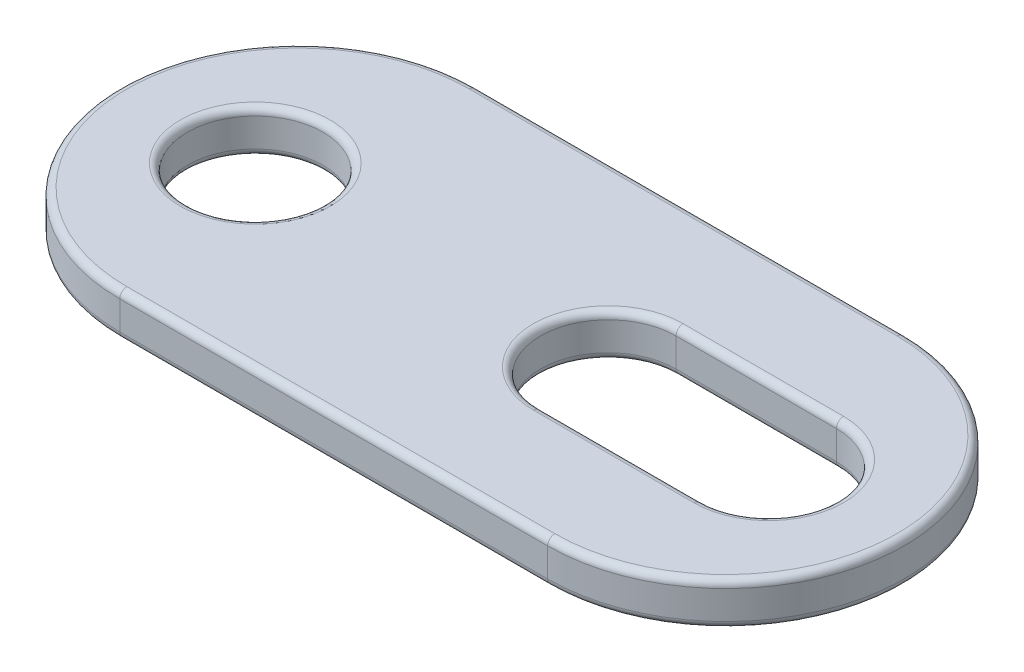
ISO-10303-21;
HEADER;
FILE_DESCRIPTION(('STEP AP214'),'2;1');
FILE_NAME('part.step','',(''),(''),'','','');
FILE_SCHEMA(('AUTOMOTIVE_DESIGN { 1 0 10303 214 1 1 1 1 }'));
ENDSEC;
DATA;
#1=APPLICATION_CONTEXT('core data for automotive mechanical design processes');
#2=APPLICATION_PROTOCOL_DEFINITION('international standard','automotive_design',2000,#1);
#3=PRODUCT_CONTEXT('',#1,'mechanical');
#4=PRODUCT('Part','Part','',(#3));
#5=PRODUCT_RELATED_PRODUCT_CATEGORY('part','',(#4));
#6=PRODUCT_DEFINITION_FORMATION('','',#4);
#7=PRODUCT_DEFINITION_CONTEXT('part definition',#1,'design');
#8=PRODUCT_DEFINITION('design','',#6,#7);
#9=PRODUCT_DEFINITION_SHAPE('','',#8);
#10=(LENGTH_UNIT() NAMED_UNIT(*) SI_UNIT(.MILLI.,.METRE.));
#11=(NAMED_UNIT(*) PLANE_ANGLE_UNIT() SI_UNIT($,.RADIAN.));
#12=(NAMED_UNIT(*) SI_UNIT($,.STERADIAN.) SOLID_ANGLE_UNIT());
#13=UNCERTAINTY_MEASURE_WITH_UNIT(LENGTH_MEASURE(1.E-05),#10,'distance_accuracy_value','');
#14=(GEOMETRIC_REPRESENTATION_CONTEXT(3) GLOBAL_UNCERTAINTY_ASSIGNED_CONTEXT((#13)) GLOBAL_UNIT_ASSIGNED_CONTEXT((#10,
#11,#12)) REPRESENTATION_CONTEXT('',''));
#15=CARTESIAN_POINT('',(0.,0.,0.));
#16=DIRECTION('',(0.,0.,1.));
#17=DIRECTION('',(1.,0.,0.));
#18=AXIS2_PLACEMENT_3D('',#15,#16,#17);
#19=CARTESIAN_POINT('',(0.,1.524,-6.35));
#20=DIRECTION('',(0.,1.,0.));
#21=DIRECTION('',(0.,0.,1.));
#22=AXIS2_PLACEMENT_3D('',#19,#20,#21);
#23=PLANE('',#22);
#24=DIRECTION('',(-1.,0.,0.));
#25=VECTOR('',#24,1.);
#26=CARTESIAN_POINT('',(0.,1.524,-9.017));
#27=LINE('',#26,#25);
#28=CARTESIAN_POINT('',(11.049,1.524,-9.017));
#29=VERTEX_POINT('',#28);
#30=CARTESIAN_POINT('',(16.764,1.524,-9.017));
#31=VERTEX_POINT('',#30);
#32=EDGE_CURVE('E52',#29,#31,#27,.F.);
#33=ORIENTED_EDGE('',*,*,#32,.T.);
#34=CARTESIAN_POINT('',(16.764,1.524,-6.35));
#35=DIRECTION('',(0.,1.,0.));
#36=DIRECTION('',(0.,0.,1.));
#37=AXIS2_PLACEMENT_3D('',#34,#35,#36);
#38=CIRCLE('',#37,2.667);
#39=CARTESIAN_POINT('',(16.764,1.524,-3.683));
#40=VERTEX_POINT('',#39);
#41=EDGE_CURVE('E12',#31,#40,#38,.F.);
#42=ORIENTED_EDGE('',*,*,#41,.T.);
#43=DIRECTION('',(1.,0.,0.));
#44=VECTOR('',#43,1.);
#45=CARTESIAN_POINT('',(0.,1.524,-3.683));
#46=LINE('',#45,#44);
#47=CARTESIAN_POINT('',(11.049,1.524,-3.683));
#48=VERTEX_POINT('',#47);
#49=EDGE_CURVE('E248',#40,#48,#46,.F.);
#50=ORIENTED_EDGE('',*,*,#49,.T.);
#51=CARTESIAN_POINT('',(11.049,1.524,-6.35));
#52=DIRECTION('',(0.,1.,0.));
#53=DIRECTION('',(0.,0.,1.));
#54=AXIS2_PLACEMENT_3D('',#51,#52,#53);
#55=CIRCLE('',#54,2.667);
#56=EDGE_CURVE('E62',#48,#29,#55,.F.);
#57=ORIENTED_EDGE('',*,*,#56,.T.);
#58=EDGE_LOOP('',(#33,#42,#50,#57));
#59=FACE_BOUND('',#58,.T.);
#60=CARTESIAN_POINT('',(15.24,1.524,-6.35));
#61=DIRECTION('',(0.,1.,0.));
#62=DIRECTION('',(0.,0.,1.));
#63=AXIS2_PLACEMENT_3D('',#60,#61,#62);
#64=CIRCLE('',#63,6.096);
#65=CARTESIAN_POINT('',(15.24,1.524,-0.254));
#66=VERTEX_POINT('',#65);
#67=CARTESIAN_POINT('',(15.24,1.524,-12.446));
#68=VERTEX_POINT('',#67);
#69=EDGE_CURVE('E243',#66,#68,#64,.T.);
#70=ORIENTED_EDGE('',*,*,#69,.T.);
#71=DIRECTION('',(-1.,0.,0.));
#72=VECTOR('',#71,1.);
#73=CARTESIAN_POINT('',(0.,1.524,-12.446));
#74=LINE('',#73,#72);
#75=CARTESIAN_POINT('',(0.,1.524,-12.446));
#76=VERTEX_POINT('',#75);
#77=EDGE_CURVE('E245',#68,#76,#74,.T.);
#78=ORIENTED_EDGE('',*,*,#77,.T.);
#79=CARTESIAN_POINT('',(0.,1.524,-6.35));
#80=DIRECTION('',(0.,1.,0.));
#81=DIRECTION('',(0.,0.,1.));
#82=AXIS2_PLACEMENT_3D('',#79,#80,#81);
#83=CIRCLE('',#82,6.096);
#84=CARTESIAN_POINT('',(0.,1.524,-0.254));
#85=VERTEX_POINT('',#84);
#86=EDGE_CURVE('E239',#76,#85,#83,.T.);
#87=ORIENTED_EDGE('',*,*,#86,.T.);
#88=DIRECTION('',(1.,0.,0.));
#89=VECTOR('',#88,1.);
#90=CARTESIAN_POINT('',(15.24,1.524,-0.254));
#91=LINE('',#90,#89);
#92=EDGE_CURVE('E241',#85,#66,#91,.T.);
#93=ORIENTED_EDGE('',*,*,#92,.T.);
#94=EDGE_LOOP('',(#70,#78,#87,#93));
#95=FACE_BOUND('',#94,.T.);
#96=CARTESIAN_POINT('',(-1.524,1.524,-6.35));
#97=DIRECTION('',(0.,1.,0.));
#98=DIRECTION('',(0.,0.,1.));
#99=AXIS2_PLACEMENT_3D('',#96,#97,#98);
#100=CIRCLE('',#99,2.667);
#101=CARTESIAN_POINT('',(-1.524,1.524,-3.683));
#102=VERTEX_POINT('',#101);
#103=EDGE_CURVE('E236',#102,#102,#100,.F.);
#104=ORIENTED_EDGE('',*,*,#103,.T.);
#105=EDGE_LOOP('',(#104));
#106=FACE_BOUND('',#105,.T.);
#107=ADVANCED_FACE('F44',(#59,#95,#106),#23,.T.);
#108=CARTESIAN_POINT('',(0.,0.,-6.35));
#109=DIRECTION('',(0.,1.,0.));
#110=DIRECTION('',(0.,0.,1.));
#111=AXIS2_PLACEMENT_3D('',#108,#109,#110);
#112=PLANE('',#111);
#113=CARTESIAN_POINT('',(16.764,0.,-6.35));
#114=DIRECTION('',(0.,1.,0.));
#115=DIRECTION('',(0.,0.,1.));
#116=AXIS2_PLACEMENT_3D('',#113,#114,#115);
#117=CIRCLE('',#116,2.667);
#118=CARTESIAN_POINT('',(16.764,0.,-3.683));
#119=VERTEX_POINT('',#118);
#120=CARTESIAN_POINT('',(16.764,0.,-9.017));
#121=VERTEX_POINT('',#120);
#122=EDGE_CURVE('E191',#119,#121,#117,.T.);
#123=ORIENTED_EDGE('',*,*,#122,.T.);
#124=DIRECTION('',(-1.,0.,0.));
#125=VECTOR('',#124,1.);
#126=CARTESIAN_POINT('',(11.049,0.,-9.017));
#127=LINE('',#126,#125);
#128=CARTESIAN_POINT('',(11.049,0.,-9.017));
#129=VERTEX_POINT('',#128);
#130=EDGE_CURVE('E193',#121,#129,#127,.T.);
#131=ORIENTED_EDGE('',*,*,#130,.T.);
#132=CARTESIAN_POINT('',(11.049,0.,-6.35));
#133=DIRECTION('',(0.,1.,0.));
#134=DIRECTION('',(0.,0.,1.));
#135=AXIS2_PLACEMENT_3D('',#132,#133,#134);
#136=CIRCLE('',#135,2.667);
#137=CARTESIAN_POINT('',(11.049,0.,-3.683));
#138=VERTEX_POINT('',#137);
#139=EDGE_CURVE('E183',#129,#138,#136,.T.);
#140=ORIENTED_EDGE('',*,*,#139,.T.);
#141=DIRECTION('',(1.,0.,0.));
#142=VECTOR('',#141,1.);
#143=CARTESIAN_POINT('',(16.764,0.,-3.683));
#144=LINE('',#143,#142);
#145=EDGE_CURVE('E185',#138,#119,#144,.T.);
#146=ORIENTED_EDGE('',*,*,#145,.T.);
#147=EDGE_LOOP('',(#123,#131,#140,#146));
#148=FACE_BOUND('',#147,.T.);
#149=CARTESIAN_POINT('',(15.24,0.,-6.35));
#150=DIRECTION('',(0.,1.,0.));
#151=DIRECTION('',(0.,0.,1.));
#152=AXIS2_PLACEMENT_3D('',#149,#150,#151);
#153=CIRCLE('',#152,6.096);
#154=CARTESIAN_POINT('',(15.24,0.,-12.446));
#155=VERTEX_POINT('',#154);
#156=CARTESIAN_POINT('',(15.24,0.,-0.254));
#157=VERTEX_POINT('',#156);
#158=EDGE_CURVE('E182',#155,#157,#153,.F.);
#159=ORIENTED_EDGE('',*,*,#158,.T.);
#160=DIRECTION('',(1.,0.,0.));
#161=VECTOR('',#160,1.);
#162=CARTESIAN_POINT('',(0.,0.,-0.254));
#163=LINE('',#162,#161);
#164=CARTESIAN_POINT('',(0.,0.,-0.254));
#165=VERTEX_POINT('',#164);
#166=EDGE_CURVE('E160',#157,#165,#163,.F.);
#167=ORIENTED_EDGE('',*,*,#166,.T.);
#168=CARTESIAN_POINT('',(0.,0.,-6.35));
#169=DIRECTION('',(0.,1.,0.));
#170=DIRECTION('',(0.,0.,1.));
#171=AXIS2_PLACEMENT_3D('',#168,#169,#170);
#172=CIRCLE('',#171,6.096);
#173=CARTESIAN_POINT('',(0.,0.,-12.446));
#174=VERTEX_POINT('',#173);
#175=EDGE_CURVE('E170',#165,#174,#172,.F.);
#176=ORIENTED_EDGE('',*,*,#175,.T.);
#177=DIRECTION('',(-1.,0.,0.));
#178=VECTOR('',#177,1.);
#179=CARTESIAN_POINT('',(0.,0.,-12.446));
#180=LINE('',#179,#178);
#181=EDGE_CURVE('E176',#174,#155,#180,.F.);
#182=ORIENTED_EDGE('',*,*,#181,.T.);
#183=EDGE_LOOP('',(#159,#167,#176,#182));
#184=FACE_BOUND('',#183,.T.);
#185=CARTESIAN_POINT('',(-1.524,0.,-6.35));
#186=DIRECTION('',(0.,1.,0.));
#187=DIRECTION('',(0.,0.,1.));
#188=AXIS2_PLACEMENT_3D('',#185,#186,#187);
#189=CIRCLE('',#188,2.667);
#190=CARTESIAN_POINT('',(-1.524,0.,-3.683));
#191=VERTEX_POINT('',#190);
#192=EDGE_CURVE('E177',#191,#191,#189,.T.);
#193=ORIENTED_EDGE('',*,*,#192,.T.);
#194=EDGE_LOOP('',(#193));
#195=FACE_BOUND('',#194,.T.);
#196=ADVANCED_FACE('F179',(#148,#184,#195),#112,.F.);
#197=CARTESIAN_POINT('',(0.,1.524,-6.35));
#198=DIRECTION('',(0.,-1.,0.));
#199=DIRECTION('',(0.,0.,-1.));
#200=AXIS2_PLACEMENT_3D('',#197,#198,#199);
#201=CYLINDRICAL_SURFACE('',#200,6.35);
#202=DIRECTION('',(0.,-1.,0.));
#203=VECTOR('',#202,1.);
#204=CARTESIAN_POINT('',(0.,1.524,-12.7));
#205=LINE('',#204,#203);
#206=CARTESIAN_POINT('',(0.,1.27,-12.7));
#207=VERTEX_POINT('',#206);
#208=CARTESIAN_POINT('',(0.,0.254000000000001,-12.7));
#209=VERTEX_POINT('',#208);
#210=EDGE_CURVE('E295',#207,#209,#205,.T.);
#211=ORIENTED_EDGE('',*,*,#210,.T.);
#212=CARTESIAN_POINT('',(0.,0.254,-6.35));
#213=DIRECTION('',(0.,1.,0.));
#214=DIRECTION('',(0.,0.,1.));
#215=AXIS2_PLACEMENT_3D('',#212,#213,#214);
#216=CIRCLE('',#215,6.35);
#217=CARTESIAN_POINT('',(0.,0.254000000000001,0.));
#218=VERTEX_POINT('',#217);
#219=EDGE_CURVE('E228',#209,#218,#216,.T.);
#220=ORIENTED_EDGE('',*,*,#219,.T.);
#221=DIRECTION('',(0.,-1.,0.));
#222=VECTOR('',#221,1.);
#223=CARTESIAN_POINT('',(0.,1.524,0.));
#224=LINE('',#223,#222);
#225=CARTESIAN_POINT('',(0.,1.27,0.));
#226=VERTEX_POINT('',#225);
#227=EDGE_CURVE('E304',#226,#218,#224,.T.);
#228=ORIENTED_EDGE('',*,*,#227,.F.);
#229=CARTESIAN_POINT('',(0.,1.27,-6.35));
#230=DIRECTION('',(0.,1.,0.));
#231=DIRECTION('',(0.,0.,1.));
#232=AXIS2_PLACEMENT_3D('',#229,#230,#231);
#233=CIRCLE('',#232,6.35);
#234=EDGE_CURVE('E226',#226,#207,#233,.F.);
#235=ORIENTED_EDGE('',*,*,#234,.T.);
#236=EDGE_LOOP('',(#211,#220,#228,#235));
#237=FACE_BOUND('',#236,.T.);
#238=ADVANCED_FACE('F46',(#237),#201,.T.);
#239=CARTESIAN_POINT('',(0.,1.524,0.));
#240=DIRECTION('',(0.,0.,-1.));
#241=DIRECTION('',(-1.,0.,0.));
#242=AXIS2_PLACEMENT_3D('',#239,#240,#241);
#243=PLANE('',#242);
#244=ORIENTED_EDGE('',*,*,#227,.T.);
#245=DIRECTION('',(1.,0.,0.));
#246=VECTOR('',#245,1.);
#247=CARTESIAN_POINT('',(0.,0.254,0.));
#248=LINE('',#247,#246);
#249=CARTESIAN_POINT('',(15.24,0.254000000000001,0.));
#250=VERTEX_POINT('',#249);
#251=EDGE_CURVE('E163',#218,#250,#248,.T.);
#252=ORIENTED_EDGE('',*,*,#251,.T.);
#253=DIRECTION('',(0.,-1.,0.));
#254=VECTOR('',#253,1.);
#255=CARTESIAN_POINT('',(15.24,1.524,0.));
#256=LINE('',#255,#254);
#257=CARTESIAN_POINT('',(15.24,1.27,0.));
#258=VERTEX_POINT('',#257);
#259=EDGE_CURVE('E301',#258,#250,#256,.T.);
#260=ORIENTED_EDGE('',*,*,#259,.F.);
#261=DIRECTION('',(1.,0.,0.));
#262=VECTOR('',#261,1.);
#263=CARTESIAN_POINT('',(0.,1.27,0.));
#264=LINE('',#263,#262);
#265=EDGE_CURVE('E214',#258,#226,#264,.F.);
#266=ORIENTED_EDGE('',*,*,#265,.T.);
#267=EDGE_LOOP('',(#244,#252,#260,#266));
#268=FACE_BOUND('',#267,.T.);
#269=ADVANCED_FACE('F319',(#268),#243,.F.);
#270=CARTESIAN_POINT('',(15.24,1.524,-6.35));
#271=DIRECTION('',(0.,-1.,0.));
#272=DIRECTION('',(0.,0.,-1.));
#273=AXIS2_PLACEMENT_3D('',#270,#271,#272);
#274=CYLINDRICAL_SURFACE('',#273,6.35);
#275=ORIENTED_EDGE('',*,*,#259,.T.);
#276=CARTESIAN_POINT('',(15.24,0.254,-6.35));
#277=DIRECTION('',(0.,1.,0.));
#278=DIRECTION('',(0.,0.,1.));
#279=AXIS2_PLACEMENT_3D('',#276,#277,#278);
#280=CIRCLE('',#279,6.35);
#281=CARTESIAN_POINT('',(15.24,0.254000000000001,-12.7));
#282=VERTEX_POINT('',#281);
#283=EDGE_CURVE('E219',#250,#282,#280,.T.);
#284=ORIENTED_EDGE('',*,*,#283,.T.);
#285=DIRECTION('',(0.,-1.,0.));
#286=VECTOR('',#285,1.);
#287=CARTESIAN_POINT('',(15.24,1.524,-12.7));
#288=LINE('',#287,#286);
#289=CARTESIAN_POINT('',(15.24,1.27,-12.7));
#290=VERTEX_POINT('',#289);
#291=EDGE_CURVE('E298',#290,#282,#288,.T.);
#292=ORIENTED_EDGE('',*,*,#291,.F.);
#293=CARTESIAN_POINT('',(15.24,1.27,-6.35));
#294=DIRECTION('',(0.,1.,0.));
#295=DIRECTION('',(0.,0.,1.));
#296=AXIS2_PLACEMENT_3D('',#293,#294,#295);
#297=CIRCLE('',#296,6.35);
#298=EDGE_CURVE('E217',#290,#258,#297,.F.);
#299=ORIENTED_EDGE('',*,*,#298,.T.);
#300=EDGE_LOOP('',(#275,#284,#292,#299));
#301=FACE_BOUND('',#300,.T.);
#302=ADVANCED_FACE('F322',(#301),#274,.T.);
#303=CARTESIAN_POINT('',(0.,1.524,-12.7));
#304=DIRECTION('',(0.,0.,1.));
#305=DIRECTION('',(1.,0.,0.));
#306=AXIS2_PLACEMENT_3D('',#303,#304,#305);
#307=PLANE('',#306);
#308=ORIENTED_EDGE('',*,*,#291,.T.);
#309=DIRECTION('',(-1.,0.,0.));
#310=VECTOR('',#309,1.);
#311=CARTESIAN_POINT('',(0.,0.254,-12.7));
#312=LINE('',#311,#310);
#313=EDGE_CURVE('E224',#282,#209,#312,.T.);
#314=ORIENTED_EDGE('',*,*,#313,.T.);
#315=ORIENTED_EDGE('',*,*,#210,.F.);
#316=DIRECTION('',(-1.,0.,0.));
#317=VECTOR('',#316,1.);
#318=CARTESIAN_POINT('',(15.24,1.27,-12.7));
#319=LINE('',#318,#317);
#320=EDGE_CURVE('E221',#207,#290,#319,.F.);
#321=ORIENTED_EDGE('',*,*,#320,.T.);
#322=EDGE_LOOP('',(#308,#314,#315,#321));
#323=FACE_BOUND('',#322,.T.);
#324=ADVANCED_FACE('F336',(#323),#307,.F.);
#325=CARTESIAN_POINT('',(-1.524,1.524,-6.35));
#326=DIRECTION('',(0.,-1.,0.));
#327=DIRECTION('',(0.,0.,-1.));
#328=AXIS2_PLACEMENT_3D('',#325,#326,#327);
#329=CYLINDRICAL_SURFACE('',#328,2.413);
#330=CARTESIAN_POINT('',(-1.524,0.254,-6.35));
#331=DIRECTION('',(0.,1.,0.));
#332=DIRECTION('',(0.,0.,1.));
#333=AXIS2_PLACEMENT_3D('',#330,#331,#332);
#334=CIRCLE('',#333,2.413);
#335=CARTESIAN_POINT('',(-1.524,0.254,-8.763));
#336=VERTEX_POINT('',#335);
#337=EDGE_CURVE('E233',#336,#336,#334,.F.);
#338=CARTESIAN_POINT('',(-1.524,1.27,-6.35));
#339=DIRECTION('',(0.,1.,0.));
#340=DIRECTION('',(0.,0.,1.));
#341=AXIS2_PLACEMENT_3D('',#338,#339,#340);
#342=CIRCLE('',#341,2.413);
#343=CARTESIAN_POINT('',(-1.524,1.27,-8.763));
#344=VERTEX_POINT('',#343);
#345=EDGE_CURVE('E230',#344,#344,#342,.T.);
#346=CARTESIAN_POINT('',(-1.524,0.254,-8.763));
#347=CARTESIAN_POINT('',(-1.524,0.264583333333333,-8.763));
#348=CARTESIAN_POINT('',(-1.524,0.275166666666667,-8.763));
#349=CARTESIAN_POINT('',(-1.524,0.296333333333333,-8.763));
#350=CARTESIAN_POINT('',(-1.524,0.306916666666667,-8.763));
#351=CARTESIAN_POINT('',(-1.524,0.328083333333333,-8.763));
#352=CARTESIAN_POINT('',(-1.524,0.338666666666667,-8.763));
#353=CARTESIAN_POINT('',(-1.524,0.359833333333333,-8.763));
#354=CARTESIAN_POINT('',(-1.524,0.370416666666667,-8.763));
#355=CARTESIAN_POINT('',(-1.524,0.391583333333333,-8.763));
#356=CARTESIAN_POINT('',(-1.524,0.402166666666667,-8.763));
#357=CARTESIAN_POINT('',(-1.524,0.423333333333333,-8.763));
#358=CARTESIAN_POINT('',(-1.524,0.433916666666667,-8.763));
#359=CARTESIAN_POINT('',(-1.524,0.455083333333333,-8.763));
#360=CARTESIAN_POINT('',(-1.524,0.465666666666667,-8.763));
#361=CARTESIAN_POINT('',(-1.524,0.486833333333333,-8.763));
#362=CARTESIAN_POINT('',(-1.524,0.497416666666667,-8.763));
#363=CARTESIAN_POINT('',(-1.524,0.518583333333333,-8.763));
#364=CARTESIAN_POINT('',(-1.524,0.529166666666666,-8.763));
#365=CARTESIAN_POINT('',(-1.524,0.550333333333333,-8.763));
#366=CARTESIAN_POINT('',(-1.524,0.560916666666667,-8.763));
#367=CARTESIAN_POINT('',(-1.524,0.582083333333333,-8.763));
#368=CARTESIAN_POINT('',(-1.524,0.592666666666666,-8.763));
#369=CARTESIAN_POINT('',(-1.524,0.613833333333333,-8.763));
#370=CARTESIAN_POINT('',(-1.524,0.624416666666667,-8.763));
#371=CARTESIAN_POINT('',(-1.524,0.645583333333333,-8.763));
#372=CARTESIAN_POINT('',(-1.524,0.656166666666666,-8.763));
#373=CARTESIAN_POINT('',(-1.524,0.677333333333333,-8.763));
#374=CARTESIAN_POINT('',(-1.524,0.687916666666666,-8.763));
#375=CARTESIAN_POINT('',(-1.524,0.709083333333333,-8.763));
#376=CARTESIAN_POINT('',(-1.524,0.719666666666666,-8.763));
#377=CARTESIAN_POINT('',(-1.524,0.740833333333333,-8.763));
#378=CARTESIAN_POINT('',(-1.524,0.751416666666666,-8.763));
#379=CARTESIAN_POINT('',(-1.524,0.772583333333333,-8.763));
#380=CARTESIAN_POINT('',(-1.524,0.783166666666666,-8.763));
#381=CARTESIAN_POINT('',(-1.524,0.804333333333333,-8.763));
#382=CARTESIAN_POINT('',(-1.524,0.814916666666666,-8.763));
#383=CARTESIAN_POINT('',(-1.524,0.836083333333333,-8.763));
#384=CARTESIAN_POINT('',(-1.524,0.846666666666666,-8.763));
#385=CARTESIAN_POINT('',(-1.524,0.867833333333333,-8.763));
#386=CARTESIAN_POINT('',(-1.524,0.878416666666666,-8.763));
#387=CARTESIAN_POINT('',(-1.524,0.899583333333333,-8.763));
#388=CARTESIAN_POINT('',(-1.524,0.910166666666666,-8.763));
#389=CARTESIAN_POINT('',(-1.524,0.931333333333333,-8.763));
#390=CARTESIAN_POINT('',(-1.524,0.941916666666666,-8.763));
#391=CARTESIAN_POINT('',(-1.524,0.963083333333333,-8.763));
#392=CARTESIAN_POINT('',(-1.524,0.973666666666667,-8.763));
#393=CARTESIAN_POINT('',(-1.524,0.994833333333333,-8.763));
#394=CARTESIAN_POINT('',(-1.524,1.00541666666667,-8.763));
#395=CARTESIAN_POINT('',(-1.524,1.02658333333333,-8.763));
#396=CARTESIAN_POINT('',(-1.524,1.03716666666667,-8.763));
#397=CARTESIAN_POINT('',(-1.524,1.05833333333333,-8.763));
#398=CARTESIAN_POINT('',(-1.524,1.06891666666667,-8.763));
#399=CARTESIAN_POINT('',(-1.524,1.09008333333333,-8.763));
#400=CARTESIAN_POINT('',(-1.524,1.10066666666667,-8.763));
#401=CARTESIAN_POINT('',(-1.524,1.12183333333333,-8.763));
#402=CARTESIAN_POINT('',(-1.524,1.13241666666667,-8.763));
#403=CARTESIAN_POINT('',(-1.524,1.15358333333333,-8.763));
#404=CARTESIAN_POINT('',(-1.524,1.16416666666667,-8.763));
#405=CARTESIAN_POINT('',(-1.524,1.18533333333333,-8.763));
#406=CARTESIAN_POINT('',(-1.524,1.19591666666667,-8.763));
#407=CARTESIAN_POINT('',(-1.524,1.21708333333333,-8.763));
#408=CARTESIAN_POINT('',(-1.524,1.22766666666667,-8.763));
#409=CARTESIAN_POINT('',(-1.524,1.24883333333333,-8.763));
#410=CARTESIAN_POINT('',(-1.524,1.25941666666667,-8.763));
#411=CARTESIAN_POINT('',(-1.524,1.27,-8.763));
#412=B_SPLINE_CURVE_WITH_KNOTS('',3,(#346,#347,#348,#349,#350,#351,#352,#353,#354,#355,#356,
#357,#358,#359,#360,#361,#362,#363,#364,#365,#366,#367,#368,#369,#370,#371,#372,#373,#374,#375,
#376,#377,#378,#379,#380,#381,#382,#383,#384,#385,#386,#387,#388,#389,#390,#391,#392,#393,#394,
#395,#396,#397,#398,#399,#400,#401,#402,#403,#404,#405,#406,#407,#408,#409,#410,#411),
.UNSPECIFIED.,.F.,.F.,(4,2,2,2,2,2,2,2,2,2,2,2,2,2,2,2,2,2,2,2,2,2,2,2,2,2,2,2,2,2,2,2,4),(0.,
0.0317500000000001,0.0635,0.0952500000000001,0.127,0.15875,0.1905,0.22225,0.254,0.28575,0.3175,
0.34925,0.381,0.41275,0.4445,0.47625,0.508,0.53975,0.5715,0.60325,0.635,0.66675,0.6985,0.73025,
0.762,0.79375,0.8255,0.85725,0.889,0.92075,0.9525,0.98425,1.016),.UNSPECIFIED.);
#413=EDGE_CURVE('BSEAM407',#336,#344,#412,.T.);
#414=ORIENTED_EDGE('',*,*,#337,.T.);
#415=ORIENTED_EDGE('',*,*,#345,.T.);
#416=ORIENTED_EDGE('',*,*,#413,.T.);
#417=ORIENTED_EDGE('',*,*,#413,.F.);
#418=EDGE_LOOP('',(#414,#416,#415,#417));
#419=FACE_BOUND('',#418,.T.);
#420=ADVANCED_FACE('F407',(#419),#329,.F.);
#421=CARTESIAN_POINT('',(11.049,1.524,-6.35));
#422=DIRECTION('',(0.,-1.,0.));
#423=DIRECTION('',(0.,0.,-1.));
#424=AXIS2_PLACEMENT_3D('',#421,#422,#423);
#425=CYLINDRICAL_SURFACE('',#424,2.413);
#426=DIRECTION('',(0.,-1.,0.));
#427=VECTOR('',#426,1.);
#428=CARTESIAN_POINT('',(11.049,1.524,-3.937));
#429=LINE('',#428,#427);
#430=CARTESIAN_POINT('',(11.049,1.27,-3.937));
#431=VERTEX_POINT('',#430);
#432=CARTESIAN_POINT('',(11.049,0.254000000000001,-3.937));
#433=VERTEX_POINT('',#432);
#434=EDGE_CURVE('E292',#431,#433,#429,.T.);
#435=ORIENTED_EDGE('',*,*,#434,.T.);
#436=CARTESIAN_POINT('',(11.049,0.254,-6.35));
#437=DIRECTION('',(0.,1.,0.));
#438=DIRECTION('',(0.,0.,1.));
#439=AXIS2_PLACEMENT_3D('',#436,#437,#438);
#440=CIRCLE('',#439,2.413);
#441=CARTESIAN_POINT('',(11.049,0.254000000000001,-8.763));
#442=VERTEX_POINT('',#441);
#443=EDGE_CURVE('E212',#433,#442,#440,.F.);
#444=ORIENTED_EDGE('',*,*,#443,.T.);
#445=DIRECTION('',(0.,-1.,0.));
#446=VECTOR('',#445,1.);
#447=CARTESIAN_POINT('',(11.049,1.524,-8.763));
#448=LINE('',#447,#446);
#449=CARTESIAN_POINT('',(11.049,1.27,-8.763));
#450=VERTEX_POINT('',#449);
#451=EDGE_CURVE('E283',#450,#442,#448,.T.);
#452=ORIENTED_EDGE('',*,*,#451,.F.);
#453=CARTESIAN_POINT('',(11.049,1.27,-6.35));
#454=DIRECTION('',(0.,1.,0.));
#455=DIRECTION('',(0.,0.,1.));
#456=AXIS2_PLACEMENT_3D('',#453,#454,#455);
#457=CIRCLE('',#456,2.413);
#458=EDGE_CURVE('E210',#450,#431,#457,.T.);
#459=ORIENTED_EDGE('',*,*,#458,.T.);
#460=EDGE_LOOP('',(#435,#444,#452,#459));
#461=FACE_BOUND('',#460,.T.);
#462=ADVANCED_FACE('F430',(#461),#425,.F.);
#463=CARTESIAN_POINT('',(11.049,1.524,-3.937));
#464=DIRECTION('',(0.,0.,-1.));
#465=DIRECTION('',(-1.,0.,0.));
#466=AXIS2_PLACEMENT_3D('',#463,#464,#465);
#467=PLANE('',#466);
#468=DIRECTION('',(0.,-1.,0.));
#469=VECTOR('',#468,1.);
#470=CARTESIAN_POINT('',(16.764,1.524,-3.937));
#471=LINE('',#470,#469);
#472=CARTESIAN_POINT('',(16.764,1.27,-3.937));
#473=VERTEX_POINT('',#472);
#474=CARTESIAN_POINT('',(16.764,0.254000000000001,-3.937));
#475=VERTEX_POINT('',#474);
#476=EDGE_CURVE('E289',#473,#475,#471,.T.);
#477=ORIENTED_EDGE('',*,*,#476,.T.);
#478=DIRECTION('',(1.,0.,0.));
#479=VECTOR('',#478,1.);
#480=CARTESIAN_POINT('',(11.049,0.254,-3.937));
#481=LINE('',#480,#479);
#482=EDGE_CURVE('E208',#475,#433,#481,.F.);
#483=ORIENTED_EDGE('',*,*,#482,.T.);
#484=ORIENTED_EDGE('',*,*,#434,.F.);
#485=DIRECTION('',(1.,0.,0.));
#486=VECTOR('',#485,1.);
#487=CARTESIAN_POINT('',(11.049,1.27,-3.937));
#488=LINE('',#487,#486);
#489=EDGE_CURVE('E206',#431,#473,#488,.T.);
#490=ORIENTED_EDGE('',*,*,#489,.T.);
#491=EDGE_LOOP('',(#477,#483,#484,#490));
#492=FACE_BOUND('',#491,.T.);
#493=ADVANCED_FACE('F385',(#492),#467,.T.);
#494=CARTESIAN_POINT('',(16.764,1.524,-6.35));
#495=DIRECTION('',(0.,-1.,0.));
#496=DIRECTION('',(0.,0.,-1.));
#497=AXIS2_PLACEMENT_3D('',#494,#495,#496);
#498=CYLINDRICAL_SURFACE('',#497,2.413);
#499=DIRECTION('',(0.,-1.,0.));
#500=VECTOR('',#499,1.);
#501=CARTESIAN_POINT('',(16.764,1.524,-8.763));
#502=LINE('',#501,#500);
#503=CARTESIAN_POINT('',(16.764,1.27,-8.763));
#504=VERTEX_POINT('',#503);
#505=CARTESIAN_POINT('',(16.764,0.254000000000001,-8.763));
#506=VERTEX_POINT('',#505);
#507=EDGE_CURVE('E286',#504,#506,#502,.T.);
#508=ORIENTED_EDGE('',*,*,#507,.T.);
#509=CARTESIAN_POINT('',(16.764,0.254,-6.35));
#510=DIRECTION('',(0.,1.,0.));
#511=DIRECTION('',(0.,0.,1.));
#512=AXIS2_PLACEMENT_3D('',#509,#510,#511);
#513=CIRCLE('',#512,2.413);
#514=EDGE_CURVE('E204',#506,#475,#513,.F.);
#515=ORIENTED_EDGE('',*,*,#514,.T.);
#516=ORIENTED_EDGE('',*,*,#476,.F.);
#517=CARTESIAN_POINT('',(16.764,1.27,-6.35));
#518=DIRECTION('',(0.,1.,0.));
#519=DIRECTION('',(0.,0.,1.));
#520=AXIS2_PLACEMENT_3D('',#517,#518,#519);
#521=CIRCLE('',#520,2.413);
#522=EDGE_CURVE('E201',#473,#504,#521,.T.);
#523=ORIENTED_EDGE('',*,*,#522,.T.);
#524=EDGE_LOOP('',(#508,#515,#516,#523));
#525=FACE_BOUND('',#524,.T.);
#526=ADVANCED_FACE('F361',(#525),#498,.F.);
#527=CARTESIAN_POINT('',(11.049,1.524,-8.763));
#528=DIRECTION('',(0.,0.,1.));
#529=DIRECTION('',(1.,0.,0.));
#530=AXIS2_PLACEMENT_3D('',#527,#528,#529);
#531=PLANE('',#530);
#532=ORIENTED_EDGE('',*,*,#451,.T.);
#533=DIRECTION('',(-1.,0.,0.));
#534=VECTOR('',#533,1.);
#535=CARTESIAN_POINT('',(16.764,0.254,-8.763));
#536=LINE('',#535,#534);
#537=EDGE_CURVE('E198',#442,#506,#536,.F.);
#538=ORIENTED_EDGE('',*,*,#537,.T.);
#539=ORIENTED_EDGE('',*,*,#507,.F.);
#540=DIRECTION('',(-1.,0.,0.));
#541=VECTOR('',#540,1.);
#542=CARTESIAN_POINT('',(11.049,1.27,-8.763));
#543=LINE('',#542,#541);
#544=EDGE_CURVE('E196',#504,#450,#543,.T.);
#545=ORIENTED_EDGE('',*,*,#544,.T.);
#546=EDGE_LOOP('',(#532,#538,#539,#545));
#547=FACE_BOUND('',#546,.T.);
#548=ADVANCED_FACE('F363',(#547),#531,.T.);
#549=CARTESIAN_POINT('',(0.,0.254,-3.683));
#550=DIRECTION('',(-1.,0.,0.));
#551=DIRECTION('',(0.,0.,1.));
#552=AXIS2_PLACEMENT_3D('',#549,#550,#551);
#553=CYLINDRICAL_SURFACE('',#552,0.254);
#554=CARTESIAN_POINT('',(11.049,0.254,-3.683));
#555=DIRECTION('',(-1.,0.,0.));
#556=DIRECTION('',(0.,0.,1.));
#557=AXIS2_PLACEMENT_3D('',#554,#555,#556);
#558=CIRCLE('',#557,0.254);
#559=EDGE_CURVE('E277',#433,#138,#558,.T.);
#560=ORIENTED_EDGE('',*,*,#559,.F.);
#561=ORIENTED_EDGE('',*,*,#482,.F.);
#562=CARTESIAN_POINT('',(16.764,0.254,-3.683));
#563=DIRECTION('',(1.,0.,0.));
#564=DIRECTION('',(0.,0.,-1.));
#565=AXIS2_PLACEMENT_3D('',#562,#563,#564);
#566=CIRCLE('',#565,0.254);
#567=EDGE_CURVE('E280',#119,#475,#566,.T.);
#568=ORIENTED_EDGE('',*,*,#567,.F.);
#569=ORIENTED_EDGE('',*,*,#145,.F.);
#570=EDGE_LOOP('',(#560,#561,#568,#569));
#571=FACE_BOUND('',#570,.T.);
#572=ADVANCED_FACE('F388',(#571),#553,.T.);
#573=CARTESIAN_POINT('',(16.764,0.254,-6.35));
#574=DIRECTION('',(0.,1.,0.));
#575=DIRECTION('',(0.,0.,1.));
#576=AXIS2_PLACEMENT_3D('',#573,#574,#575);
#577=TOROIDAL_SURFACE('',#576,2.667,0.254);
#578=ORIENTED_EDGE('',*,*,#567,.T.);
#579=ORIENTED_EDGE('',*,*,#514,.F.);
#580=CARTESIAN_POINT('',(16.764,0.254,-9.017));
#581=DIRECTION('',(-1.,0.,0.));
#582=DIRECTION('',(0.,0.,1.));
#583=AXIS2_PLACEMENT_3D('',#580,#581,#582);
#584=CIRCLE('',#583,0.254);
#585=EDGE_CURVE('E275',#121,#506,#584,.T.);
#586=ORIENTED_EDGE('',*,*,#585,.F.);
#587=ORIENTED_EDGE('',*,*,#122,.F.);
#588=EDGE_LOOP('',(#578,#579,#586,#587));
#589=FACE_BOUND('',#588,.T.);
#590=ADVANCED_FACE('F382',(#589),#577,.T.);
#591=CARTESIAN_POINT('',(11.049,0.254,-6.35));
#592=DIRECTION('',(0.,1.,0.));
#593=DIRECTION('',(0.,0.,1.));
#594=AXIS2_PLACEMENT_3D('',#591,#592,#593);
#595=TOROIDAL_SURFACE('',#594,2.667,0.254);
#596=ORIENTED_EDGE('',*,*,#559,.T.);
#597=ORIENTED_EDGE('',*,*,#139,.F.);
#598=CARTESIAN_POINT('',(11.049,0.254,-9.017));
#599=DIRECTION('',(1.,0.,0.));
#600=DIRECTION('',(0.,0.,-1.));
#601=AXIS2_PLACEMENT_3D('',#598,#599,#600);
#602=CIRCLE('',#601,0.254);
#603=EDGE_CURVE('E273',#442,#129,#602,.T.);
#604=ORIENTED_EDGE('',*,*,#603,.F.);
#605=ORIENTED_EDGE('',*,*,#443,.F.);
#606=EDGE_LOOP('',(#596,#597,#604,#605));
#607=FACE_BOUND('',#606,.T.);
#608=ADVANCED_FACE('F375',(#607),#595,.T.);
#609=CARTESIAN_POINT('',(0.,0.254,-9.017));
#610=DIRECTION('',(1.,0.,0.));
#611=DIRECTION('',(0.,0.,-1.));
#612=AXIS2_PLACEMENT_3D('',#609,#610,#611);
#613=CYLINDRICAL_SURFACE('',#612,0.254);
#614=ORIENTED_EDGE('',*,*,#585,.T.);
#615=ORIENTED_EDGE('',*,*,#537,.F.);
#616=ORIENTED_EDGE('',*,*,#603,.T.);
#617=ORIENTED_EDGE('',*,*,#130,.F.);
#618=EDGE_LOOP('',(#614,#615,#616,#617));
#619=FACE_BOUND('',#618,.T.);
#620=ADVANCED_FACE('F368',(#619),#613,.T.);
#621=CARTESIAN_POINT('',(0.,0.254,-12.446));
#622=DIRECTION('',(-1.,0.,0.));
#623=DIRECTION('',(0.,0.,1.));
#624=AXIS2_PLACEMENT_3D('',#621,#622,#623);
#625=CYLINDRICAL_SURFACE('',#624,0.254);
#626=CARTESIAN_POINT('',(15.24,0.254,-12.446));
#627=DIRECTION('',(1.,0.,0.));
#628=DIRECTION('',(0.,0.,-1.));
#629=AXIS2_PLACEMENT_3D('',#626,#627,#628);
#630=CIRCLE('',#629,0.254);
#631=EDGE_CURVE('E166',#155,#282,#630,.T.);
#632=ORIENTED_EDGE('',*,*,#631,.F.);
#633=ORIENTED_EDGE('',*,*,#181,.F.);
#634=CARTESIAN_POINT('',(0.,0.254,-12.446));
#635=DIRECTION('',(-1.,0.,0.));
#636=DIRECTION('',(0.,0.,1.));
#637=AXIS2_PLACEMENT_3D('',#634,#635,#636);
#638=CIRCLE('',#637,0.254);
#639=EDGE_CURVE('E173',#209,#174,#638,.T.);
#640=ORIENTED_EDGE('',*,*,#639,.F.);
#641=ORIENTED_EDGE('',*,*,#313,.F.);
#642=EDGE_LOOP('',(#632,#633,#640,#641));
#643=FACE_BOUND('',#642,.T.);
#644=ADVANCED_FACE('F311',(#643),#625,.T.);
#645=CARTESIAN_POINT('',(0.,0.254,-6.35));
#646=DIRECTION('',(0.,1.,0.));
#647=DIRECTION('',(0.,0.,1.));
#648=AXIS2_PLACEMENT_3D('',#645,#646,#647);
#649=TOROIDAL_SURFACE('',#648,6.096,0.254);
#650=ORIENTED_EDGE('',*,*,#639,.T.);
#651=ORIENTED_EDGE('',*,*,#175,.F.);
#652=CARTESIAN_POINT('',(0.,0.254,-0.254));
#653=DIRECTION('',(1.,0.,0.));
#654=DIRECTION('',(0.,0.,-1.));
#655=AXIS2_PLACEMENT_3D('',#652,#653,#654);
#656=CIRCLE('',#655,0.254);
#657=EDGE_CURVE('E156',#218,#165,#656,.T.);
#658=ORIENTED_EDGE('',*,*,#657,.F.);
#659=ORIENTED_EDGE('',*,*,#219,.F.);
#660=EDGE_LOOP('',(#650,#651,#658,#659));
#661=FACE_BOUND('',#660,.T.);
#662=ADVANCED_FACE('F171',(#661),#649,.T.);
#663=CARTESIAN_POINT('',(15.24,0.254,-6.35));
#664=DIRECTION('',(0.,1.,0.));
#665=DIRECTION('',(0.,0.,1.));
#666=AXIS2_PLACEMENT_3D('',#663,#664,#665);
#667=TOROIDAL_SURFACE('',#666,6.096,0.254);
#668=ORIENTED_EDGE('',*,*,#631,.T.);
#669=ORIENTED_EDGE('',*,*,#283,.F.);
#670=CARTESIAN_POINT('',(15.24,0.254,-0.254));
#671=DIRECTION('',(-1.,0.,0.));
#672=DIRECTION('',(0.,0.,1.));
#673=AXIS2_PLACEMENT_3D('',#670,#671,#672);
#674=CIRCLE('',#673,0.254);
#675=EDGE_CURVE('E167',#157,#250,#674,.T.);
#676=ORIENTED_EDGE('',*,*,#675,.F.);
#677=ORIENTED_EDGE('',*,*,#158,.F.);
#678=EDGE_LOOP('',(#668,#669,#676,#677));
#679=FACE_BOUND('',#678,.T.);
#680=ADVANCED_FACE('F314',(#679),#667,.T.);
#681=CARTESIAN_POINT('',(0.,0.254,-0.254));
#682=DIRECTION('',(1.,0.,0.));
#683=DIRECTION('',(0.,0.,-1.));
#684=AXIS2_PLACEMENT_3D('',#681,#682,#683);
#685=CYLINDRICAL_SURFACE('',#684,0.254);
#686=ORIENTED_EDGE('',*,*,#657,.T.);
#687=ORIENTED_EDGE('',*,*,#166,.F.);
#688=ORIENTED_EDGE('',*,*,#675,.T.);
#689=ORIENTED_EDGE('',*,*,#251,.F.);
#690=EDGE_LOOP('',(#686,#687,#688,#689));
#691=FACE_BOUND('',#690,.T.);
#692=ADVANCED_FACE('F158',(#691),#685,.T.);
#693=CARTESIAN_POINT('',(-1.524,0.254,-6.35));
#694=DIRECTION('',(0.,1.,0.));
#695=DIRECTION('',(0.,0.,1.));
#696=AXIS2_PLACEMENT_3D('',#693,#694,#695);
#697=TOROIDAL_SURFACE('',#696,2.667,0.254);
#698=ORIENTED_EDGE('',*,*,#337,.F.);
#699=EDGE_LOOP('',(#698));
#700=FACE_BOUND('',#699,.T.);
#701=ORIENTED_EDGE('',*,*,#192,.F.);
#702=EDGE_LOOP('',(#701));
#703=FACE_BOUND('',#702,.T.);
#704=ADVANCED_FACE('F511',(#700,#703),#697,.T.);
#705=CARTESIAN_POINT('',(11.049,1.27,-6.35));
#706=DIRECTION('',(0.,1.,0.));
#707=DIRECTION('',(0.,0.,1.));
#708=AXIS2_PLACEMENT_3D('',#705,#706,#707);
#709=TOROIDAL_SURFACE('',#708,2.667,0.254);
#710=CARTESIAN_POINT('',(11.049,1.27,-9.017));
#711=DIRECTION('',(1.,0.,0.));
#712=DIRECTION('',(0.,0.,-1.));
#713=AXIS2_PLACEMENT_3D('',#710,#711,#712);
#714=CIRCLE('',#713,0.254);
#715=EDGE_CURVE('E262',#29,#450,#714,.T.);
#716=ORIENTED_EDGE('',*,*,#715,.F.);
#717=ORIENTED_EDGE('',*,*,#56,.F.);
#718=CARTESIAN_POINT('',(11.049,1.27,-3.683));
#719=DIRECTION('',(1.,0.,0.));
#720=DIRECTION('',(0.,0.,-1.));
#721=AXIS2_PLACEMENT_3D('',#718,#719,#720);
#722=CIRCLE('',#721,0.254);
#723=EDGE_CURVE('E259',#431,#48,#722,.T.);
#724=ORIENTED_EDGE('',*,*,#723,.F.);
#725=ORIENTED_EDGE('',*,*,#458,.F.);
#726=EDGE_LOOP('',(#716,#717,#724,#725));
#727=FACE_BOUND('',#726,.T.);
#728=ADVANCED_FACE('F257',(#727),#709,.T.);
#729=CARTESIAN_POINT('',(11.049,1.27,-3.683));
#730=DIRECTION('',(1.,0.,0.));
#731=DIRECTION('',(0.,0.,-1.));
#732=AXIS2_PLACEMENT_3D('',#729,#730,#731);
#733=CYLINDRICAL_SURFACE('',#732,0.254);
#734=ORIENTED_EDGE('',*,*,#723,.T.);
#735=ORIENTED_EDGE('',*,*,#49,.F.);
#736=CARTESIAN_POINT('',(16.764,1.27,-3.683));
#737=DIRECTION('',(1.,0.,0.));
#738=DIRECTION('',(0.,0.,-1.));
#739=AXIS2_PLACEMENT_3D('',#736,#737,#738);
#740=CIRCLE('',#739,0.254);
#741=EDGE_CURVE('E266',#473,#40,#740,.T.);
#742=ORIENTED_EDGE('',*,*,#741,.F.);
#743=ORIENTED_EDGE('',*,*,#489,.F.);
#744=EDGE_LOOP('',(#734,#735,#742,#743));
#745=FACE_BOUND('',#744,.T.);
#746=ADVANCED_FACE('F263',(#745),#733,.T.);
#747=CARTESIAN_POINT('',(11.049,1.27,-9.017));
#748=DIRECTION('',(-1.,0.,0.));
#749=DIRECTION('',(0.,0.,1.));
#750=AXIS2_PLACEMENT_3D('',#747,#748,#749);
#751=CYLINDRICAL_SURFACE('',#750,0.254);
#752=ORIENTED_EDGE('',*,*,#715,.T.);
#753=ORIENTED_EDGE('',*,*,#544,.F.);
#754=CARTESIAN_POINT('',(16.764,1.27,-9.017));
#755=DIRECTION('',(1.,0.,0.));
#756=DIRECTION('',(0.,0.,-1.));
#757=AXIS2_PLACEMENT_3D('',#754,#755,#756);
#758=CIRCLE('',#757,0.254);
#759=EDGE_CURVE('E352',#31,#504,#758,.T.);
#760=ORIENTED_EDGE('',*,*,#759,.F.);
#761=ORIENTED_EDGE('',*,*,#32,.F.);
#762=EDGE_LOOP('',(#752,#753,#760,#761));
#763=FACE_BOUND('',#762,.T.);
#764=ADVANCED_FACE('F537',(#763),#751,.T.);
#765=CARTESIAN_POINT('',(16.764,1.27,-6.35));
#766=DIRECTION('',(0.,1.,0.));
#767=DIRECTION('',(0.,0.,1.));
#768=AXIS2_PLACEMENT_3D('',#765,#766,#767);
#769=TOROIDAL_SURFACE('',#768,2.667,0.254);
#770=ORIENTED_EDGE('',*,*,#741,.T.);
#771=ORIENTED_EDGE('',*,*,#41,.F.);
#772=ORIENTED_EDGE('',*,*,#759,.T.);
#773=ORIENTED_EDGE('',*,*,#522,.F.);
#774=EDGE_LOOP('',(#770,#771,#772,#773));
#775=FACE_BOUND('',#774,.T.);
#776=ADVANCED_FACE('F355',(#775),#769,.T.);
#777=CARTESIAN_POINT('',(0.,1.27,-0.254));
#778=DIRECTION('',(-1.,0.,0.));
#779=DIRECTION('',(0.,0.,1.));
#780=AXIS2_PLACEMENT_3D('',#777,#778,#779);
#781=CYLINDRICAL_SURFACE('',#780,0.254);
#782=CARTESIAN_POINT('',(0.,1.27,-0.254));
#783=DIRECTION('',(-1.,0.,0.));
#784=DIRECTION('',(0.,0.,1.));
#785=AXIS2_PLACEMENT_3D('',#782,#783,#784);
#786=CIRCLE('',#785,0.254);
#787=EDGE_CURVE('E347',#226,#85,#786,.T.);
#788=ORIENTED_EDGE('',*,*,#787,.F.);
#789=ORIENTED_EDGE('',*,*,#265,.F.);
#790=CARTESIAN_POINT('',(15.24,1.27,-0.254));
#791=DIRECTION('',(1.,0.,0.));
#792=DIRECTION('',(0.,0.,-1.));
#793=AXIS2_PLACEMENT_3D('',#790,#791,#792);
#794=CIRCLE('',#793,0.254);
#795=EDGE_CURVE('E332',#66,#258,#794,.T.);
#796=ORIENTED_EDGE('',*,*,#795,.F.);
#797=ORIENTED_EDGE('',*,*,#92,.F.);
#798=EDGE_LOOP('',(#788,#789,#796,#797));
#799=FACE_BOUND('',#798,.T.);
#800=ADVANCED_FACE('F419',(#799),#781,.T.);
#801=CARTESIAN_POINT('',(15.24,1.27,-6.35));
#802=DIRECTION('',(0.,1.,0.));
#803=DIRECTION('',(0.,0.,1.));
#804=AXIS2_PLACEMENT_3D('',#801,#802,#803);
#805=TOROIDAL_SURFACE('',#804,6.096,0.254);
#806=ORIENTED_EDGE('',*,*,#795,.T.);
#807=ORIENTED_EDGE('',*,*,#298,.F.);
#808=CARTESIAN_POINT('',(15.24,1.27,-12.446));
#809=DIRECTION('',(-1.,0.,0.));
#810=DIRECTION('',(0.,0.,1.));
#811=AXIS2_PLACEMENT_3D('',#808,#809,#810);
#812=CIRCLE('',#811,0.254);
#813=EDGE_CURVE('E329',#68,#290,#812,.T.);
#814=ORIENTED_EDGE('',*,*,#813,.F.);
#815=ORIENTED_EDGE('',*,*,#69,.F.);
#816=EDGE_LOOP('',(#806,#807,#814,#815));
#817=FACE_BOUND('',#816,.T.);
#818=ADVANCED_FACE('F327',(#817),#805,.T.);
#819=CARTESIAN_POINT('',(0.,1.27,-6.35));
#820=DIRECTION('',(0.,1.,0.));
#821=DIRECTION('',(0.,0.,1.));
#822=AXIS2_PLACEMENT_3D('',#819,#820,#821);
#823=TOROIDAL_SURFACE('',#822,6.096,0.254);
#824=ORIENTED_EDGE('',*,*,#787,.T.);
#825=ORIENTED_EDGE('',*,*,#86,.F.);
#826=CARTESIAN_POINT('',(0.,1.27,-12.446));
#827=DIRECTION('',(1.,0.,0.));
#828=DIRECTION('',(0.,1.,0.));
#829=AXIS2_PLACEMENT_3D('',#826,#827,#828);
#830=CIRCLE('',#829,0.254);
#831=EDGE_CURVE('E340',#207,#76,#830,.T.);
#832=ORIENTED_EDGE('',*,*,#831,.F.);
#833=ORIENTED_EDGE('',*,*,#234,.F.);
#834=EDGE_LOOP('',(#824,#825,#832,#833));
#835=FACE_BOUND('',#834,.T.);
#836=ADVANCED_FACE('F345',(#835),#823,.T.);
#837=CARTESIAN_POINT('',(0.,1.27,-12.446));
#838=DIRECTION('',(1.,0.,0.));
#839=DIRECTION('',(0.,0.,-1.));
#840=AXIS2_PLACEMENT_3D('',#837,#838,#839);
#841=CYLINDRICAL_SURFACE('',#840,0.254);
#842=ORIENTED_EDGE('',*,*,#813,.T.);
#843=ORIENTED_EDGE('',*,*,#320,.F.);
#844=ORIENTED_EDGE('',*,*,#831,.T.);
#845=ORIENTED_EDGE('',*,*,#77,.F.);
#846=EDGE_LOOP('',(#842,#843,#844,#845));
#847=FACE_BOUND('',#846,.T.);
#848=ADVANCED_FACE('F339',(#847),#841,.T.);
#849=CARTESIAN_POINT('',(-1.524,1.27,-6.35));
#850=DIRECTION('',(0.,1.,0.));
#851=DIRECTION('',(0.,0.,1.));
#852=AXIS2_PLACEMENT_3D('',#849,#850,#851);
#853=TOROIDAL_SURFACE('',#852,2.667,0.254);
#854=ORIENTED_EDGE('',*,*,#103,.F.);
#855=EDGE_LOOP('',(#854));
#856=FACE_BOUND('',#855,.T.);
#857=ORIENTED_EDGE('',*,*,#345,.F.);
#858=EDGE_LOOP('',(#857));
#859=FACE_BOUND('',#858,.T.);
#860=ADVANCED_FACE('F423',(#856,#859),#853,.T.);
#861=CLOSED_SHELL('',(#107,#196,#238,#269,#302,#324,#420,#462,#493,#526,#548,#572,#590,#608,
#620,#644,#662,#680,#692,#704,#728,#746,#764,#776,#800,#818,#836,#848,#860));
#862=MANIFOLD_SOLID_BREP('B2',#861);
#863=ADVANCED_BREP_SHAPE_REPRESENTATION('',(#18,#862),#14);
#864=SHAPE_DEFINITION_REPRESENTATION(#9,#863);
ENDSEC;
END-ISO-10303-21;
